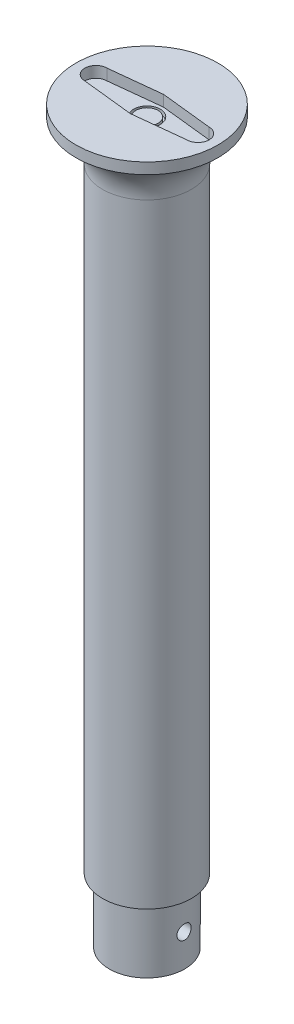
ISO-10303-21;
HEADER;
FILE_DESCRIPTION(('STEP AP214'),'2;1');
FILE_NAME('part.step','',(''),(''),'','','');
FILE_SCHEMA(('AUTOMOTIVE_DESIGN { 1 0 10303 214 1 1 1 1 }'));
ENDSEC;
DATA;
#1=APPLICATION_CONTEXT('core data for automotive mechanical design processes');
#2=APPLICATION_PROTOCOL_DEFINITION('international standard','automotive_design',2000,#1);
#3=PRODUCT_CONTEXT('',#1,'mechanical');
#4=PRODUCT('Part','Part','',(#3));
#5=PRODUCT_RELATED_PRODUCT_CATEGORY('part','',(#4));
#6=PRODUCT_DEFINITION_FORMATION('','',#4);
#7=PRODUCT_DEFINITION_CONTEXT('part definition',#1,'design');
#8=PRODUCT_DEFINITION('design','',#6,#7);
#9=PRODUCT_DEFINITION_SHAPE('','',#8);
#10=(LENGTH_UNIT() NAMED_UNIT(*) SI_UNIT(.MILLI.,.METRE.));
#11=(NAMED_UNIT(*) PLANE_ANGLE_UNIT() SI_UNIT($,.RADIAN.));
#12=(NAMED_UNIT(*) SI_UNIT($,.STERADIAN.) SOLID_ANGLE_UNIT());
#13=UNCERTAINTY_MEASURE_WITH_UNIT(LENGTH_MEASURE(1.E-05),#10,'distance_accuracy_value','');
#14=(GEOMETRIC_REPRESENTATION_CONTEXT(3) GLOBAL_UNCERTAINTY_ASSIGNED_CONTEXT((#13)) GLOBAL_UNIT_ASSIGNED_CONTEXT((#10,
#11,#12)) REPRESENTATION_CONTEXT('',''));
#15=CARTESIAN_POINT('',(0.,0.,0.));
#16=DIRECTION('',(0.,0.,1.));
#17=DIRECTION('',(1.,0.,0.));
#18=AXIS2_PLACEMENT_3D('',#15,#16,#17);
#19=CARTESIAN_POINT('',(0.,150.,0.));
#20=DIRECTION('',(0.,-1.,0.));
#21=DIRECTION('',(0.,0.,-1.));
#22=AXIS2_PLACEMENT_3D('',#19,#20,#21);
#23=CYLINDRICAL_SURFACE('',#22,10.);
#24=CARTESIAN_POINT('',(0.,138.334848610088,0.));
#25=DIRECTION('',(0.,1.,0.));
#26=DIRECTION('',(0.,0.,1.));
#27=AXIS2_PLACEMENT_3D('',#24,#25,#26);
#28=CIRCLE('',#27,10.);
#29=CARTESIAN_POINT('',(0.,138.334848610088,10.));
#30=VERTEX_POINT('',#29);
#31=EDGE_CURVE('E11',#30,#30,#28,.F.);
#32=ORIENTED_EDGE('',*,*,#31,.T.);
#33=EDGE_LOOP('',(#32));
#34=FACE_BOUND('',#33,.T.);
#35=CARTESIAN_POINT('',(0.,0.,0.));
#36=DIRECTION('',(0.,1.,0.));
#37=DIRECTION('',(0.,0.,1.));
#38=AXIS2_PLACEMENT_3D('',#35,#36,#37);
#39=CIRCLE('',#38,10.);
#40=CARTESIAN_POINT('',(0.,0.,10.));
#41=VERTEX_POINT('',#40);
#42=EDGE_CURVE('E422',#41,#41,#39,.T.);
#43=ORIENTED_EDGE('',*,*,#42,.T.);
#44=EDGE_LOOP('',(#43));
#45=FACE_BOUND('',#44,.T.);
#46=ADVANCED_FACE('F35',(#34,#45),#23,.T.);
#47=CARTESIAN_POINT('',(0.,-14.5,0.));
#48=DIRECTION('',(0.,1.,0.));
#49=DIRECTION('',(0.,0.,1.));
#50=AXIS2_PLACEMENT_3D('',#47,#48,#49);
#51=CYLINDRICAL_SURFACE('',#50,4.5);
#52=CARTESIAN_POINT('',(-4.20594816896262,-7.25,1.6));
#53=CARTESIAN_POINT('',(-4.2059466325233,-7.16323426282831,1.60000176653876));
#54=CARTESIAN_POINT('',(-4.20866230317316,-7.07648076753901,1.59291854303746));
#55=CARTESIAN_POINT('',(-4.21916503629978,-6.9055678211521,1.56488549388392));
#56=CARTESIAN_POINT('',(-4.22695238681397,-6.82140851767154,1.54393488065575));
#57=CARTESIAN_POINT('',(-4.24660725999297,-6.65819300086988,1.48901532580341));
#58=CARTESIAN_POINT('',(-4.25846587175187,-6.5791260868079,1.45507479717298));
#59=CARTESIAN_POINT('',(-4.28491342753786,-6.42777985879535,1.37523793238815));
#60=CARTESIAN_POINT('',(-4.29950309484093,-6.35550235054208,1.32933842782722));
#61=CARTESIAN_POINT('',(-4.33049821715604,-6.21656342045125,1.22469397197854));
#62=CARTESIAN_POINT('',(-4.34695329506707,-6.15024826034116,1.16550386227185));
#63=CARTESIAN_POINT('',(-4.37940865052658,-6.02824515816139,1.03690554397058));
#64=CARTESIAN_POINT('',(-4.39540884266521,-5.9725592007729,0.967495431377931));
#65=CARTESIAN_POINT('',(-4.42573409720288,-5.87177419302494,0.817845378245921));
#66=CARTESIAN_POINT('',(-4.43999410197754,-5.82704499957832,0.737341993795031));
#67=CARTESIAN_POINT('',(-4.46464150404038,-5.7519046294465,0.569357946732585));
#68=CARTESIAN_POINT('',(-4.47503009900766,-5.72148902387014,0.481879452160411));
#69=CARTESIAN_POINT('',(-4.49041230463715,-5.67703421399072,0.306064086351644));
#70=CARTESIAN_POINT('',(-4.49560126712181,-5.66240030586794,0.217895003496385));
#71=CARTESIAN_POINT('',(-4.50069695820355,-5.64802577950272,0.0402101033913121));
#72=CARTESIAN_POINT('',(-4.50060523219943,-5.64828080399948,-0.0493053121862002));
#73=CARTESIAN_POINT('',(-4.4952780652434,-5.66331569739006,-0.22290495965723));
#74=CARTESIAN_POINT('',(-4.4902719419118,-5.6774480261225,-0.30705349767567));
#75=CARTESIAN_POINT('',(-4.47597306722529,-5.71875598140395,-0.471695779950199));
#76=CARTESIAN_POINT('',(-4.46668001702659,-5.74593251727642,-0.552189268981258));
#77=CARTESIAN_POINT('',(-4.44457683482582,-5.81289445625312,-0.708565539356495));
#78=CARTESIAN_POINT('',(-4.43171938190803,-5.85285070479291,-0.784368197988855));
#79=CARTESIAN_POINT('',(-4.40380656130014,-5.94409200933397,-0.928372679166686));
#80=CARTESIAN_POINT('',(-4.38875052802483,-5.99538049841174,-0.996572188915132));
#81=CARTESIAN_POINT('',(-4.35706614584535,-6.1110203126819,-1.12726941265176));
#82=CARTESIAN_POINT('',(-4.34039675880494,-6.17592056928342,-1.1892722210196));
#83=CARTESIAN_POINT('',(-4.30802023964381,-6.31531947092054,-1.30168812080593));
#84=CARTESIAN_POINT('',(-4.29231330191229,-6.38982004559848,-1.35209887656043));
#85=CARTESIAN_POINT('',(-4.26339726836409,-6.54807084785238,-1.4407164863627));
#86=CARTESIAN_POINT('',(-4.25023875982108,-6.63196457914471,-1.47868487992807));
#87=CARTESIAN_POINT('',(-4.22849275530212,-6.80554396451463,-1.53977696586342));
#88=CARTESIAN_POINT('',(-4.21990302236055,-6.89522675998343,-1.56290792408896));
#89=CARTESIAN_POINT('',(-4.20878436155374,-7.07299116017478,-1.59259987609534));
#90=CARTESIAN_POINT('',(-4.20597138454346,-7.16092507733671,-1.599938346667));
#91=CARTESIAN_POINT('',(-4.20592526250886,-7.33679387629433,-1.60006084059022));
#92=CARTESIAN_POINT('',(-4.20869091595066,-7.42472875380396,-1.5928479980256));
#93=CARTESIAN_POINT('',(-4.21920440878006,-7.59433850449755,-1.56477477747803));
#94=CARTESIAN_POINT('',(-4.2267435811876,-7.67612226506307,-1.54448538518019));
#95=CARTESIAN_POINT('',(-4.24571569518896,-7.83509788139652,-1.49153731182258));
#96=CARTESIAN_POINT('',(-4.25714938455108,-7.91228885197801,-1.45887625520133));
#97=CARTESIAN_POINT('',(-4.28311428356285,-8.06287572892673,-1.38082408078295));
#98=CARTESIAN_POINT('',(-4.29773959575628,-8.13604546583477,-1.33502880420585));
#99=CARTESIAN_POINT('',(-4.32827026027054,-8.273940409037,-1.23245127572623));
#100=CARTESIAN_POINT('',(-4.34417603760685,-8.33866279262185,-1.17566536692775));
#101=CARTESIAN_POINT('',(-4.37655106164894,-8.46157460727323,-1.04895384178491));
#102=CARTESIAN_POINT('',(-4.39300206653244,-8.51919617929677,-0.978470952986765));
#103=CARTESIAN_POINT('',(-4.42374953260242,-8.62184694046426,-0.828430051411223));
#104=CARTESIAN_POINT('',(-4.43804603306841,-8.66687635919287,-0.748872204128968));
#105=CARTESIAN_POINT('',(-4.46283245956967,-8.74270057384014,-0.583179723822163));
#106=CARTESIAN_POINT('',(-4.47334198935967,-8.77356891041073,-0.497081838670387));
#107=CARTESIAN_POINT('',(-4.48944893555702,-8.82023476087969,-0.320462563958087));
#108=CARTESIAN_POINT('',(-4.49504839987068,-8.83603855818543,-0.229943035237847));
#109=CARTESIAN_POINT('',(-4.50052895830501,-8.8515016350738,-0.0522106120370213));
#110=CARTESIAN_POINT('',(-4.50069711468001,-8.85197138370821,0.034923611012784));
#111=CARTESIAN_POINT('',(-4.49602458744543,-8.83879676601807,0.207972694133839));
#112=CARTESIAN_POINT('',(-4.49118440869754,-8.82515382231354,0.293887676224896));
#113=CARTESIAN_POINT('',(-4.47715852799092,-8.78469752023003,0.460318849771978));
#114=CARTESIAN_POINT('',(-4.4680622130594,-8.75815466054012,0.540908883445951));
#115=CARTESIAN_POINT('',(-4.44646479553112,-8.69291155102766,0.696511100383458));
#116=CARTESIAN_POINT('',(-4.43396305599403,-8.65420902669031,0.771522236842401));
#117=CARTESIAN_POINT('',(-4.40620368815907,-8.56397982266331,0.91710460814753));
#118=CARTESIAN_POINT('',(-4.39085607935692,-8.51200349786353,0.987379726148113));
#119=CARTESIAN_POINT('',(-4.35930983262607,-8.39743699418361,1.11846844464826));
#120=CARTESIAN_POINT('',(-4.34311090638464,-8.33484320332651,1.17927881177039));
#121=CARTESIAN_POINT('',(-4.31078383381187,-8.19737295049359,1.29258553896772));
#122=CARTESIAN_POINT('',(-4.2946934875441,-8.12206282098584,1.34456840125154));
#123=CARTESIAN_POINT('',(-4.26528713327712,-7.96326623970469,1.43513154115348));
#124=CARTESIAN_POINT('',(-4.25197089911296,-7.87978045528407,1.47371291152588));
#125=CARTESIAN_POINT('',(-4.22981442205812,-7.70681156384301,1.53615714900875));
#126=CARTESIAN_POINT('',(-4.22097742332361,-7.61732416302126,1.56000935101059));
#127=CARTESIAN_POINT('',(-4.20904652279639,-7.43521882297485,1.59192596833137));
#128=CARTESIAN_POINT('',(-4.2059498087577,-7.34260243934036,1.59999811462677));
#129=CARTESIAN_POINT('',(-4.20594816896262,-7.25,1.6));
#130=B_SPLINE_CURVE_WITH_KNOTS('',3,(#52,#53,#54,#55,#56,#57,#58,#59,#60,#61,#62,#63,#64,#65,
#66,#67,#68,#69,#70,#71,#72,#73,#74,#75,#76,#77,#78,#79,#80,#81,#82,#83,#84,#85,#86,#87,#88,#89,
#90,#91,#92,#93,#94,#95,#96,#97,#98,#99,#100,#101,#102,#103,#104,#105,#106,#107,#108,#109,#110,
#111,#112,#113,#114,#115,#116,#117,#118,#119,#120,#121,#122,#123,#124,#125,#126,#127,#128,#129),
.UNSPECIFIED.,.T.,.F.,(4,2,2,2,2,2,2,2,2,2,2,2,2,2,2,2,2,2,2,2,2,2,2,2,2,2,2,2,2,2,2,2,2,2,2,2,
2,2,4),(0.,0.259953291970315,0.519921348833398,0.779323994607175,1.03879543642786,
1.30878128533634,1.57881749670462,1.85699611078511,2.13508859452633,2.40229005360034,
2.66941331629628,2.92463711542367,3.17987870901695,3.43868609999424,3.69757200384698,
3.97020163398208,4.24288614778309,4.52052674832307,4.79803128494058,5.06152801645349,
5.32496800170101,5.57761967779331,5.83031989174368,6.09183114994743,6.3534295704366,
6.62965935621094,6.90588410533624,7.18065767081423,7.45531657824236,7.7154337013378,
7.97552460606454,8.23038272661511,8.48528854782629,8.75035401487215,9.01550983658238,
9.29290814086468,9.57028382084662,9.84786010846342,10.1253003715868),.UNSPECIFIED.);
#131=CARTESIAN_POINT('',(-4.20594816896262,-7.25,1.6));
#132=VERTEX_POINT('',#131);
#133=EDGE_CURVE('E152',#132,#132,#130,.T.);
#134=ORIENTED_EDGE('',*,*,#133,.T.);
#135=EDGE_LOOP('',(#134));
#136=FACE_BOUND('',#135,.T.);
#137=CARTESIAN_POINT('',(0.,-14.5,0.));
#138=DIRECTION('',(0.,-1.,0.));
#139=DIRECTION('',(0.,0.,-1.));
#140=AXIS2_PLACEMENT_3D('',#137,#138,#139);
#141=CIRCLE('',#140,4.5);
#142=CARTESIAN_POINT('',(0.,-14.5,-4.5));
#143=VERTEX_POINT('',#142);
#144=EDGE_CURVE('E415',#143,#143,#141,.T.);
#145=ORIENTED_EDGE('',*,*,#144,.T.);
#146=EDGE_LOOP('',(#145));
#147=FACE_BOUND('',#146,.T.);
#148=CARTESIAN_POINT('',(0.,0.,0.));
#149=DIRECTION('',(0.,-1.,0.));
#150=DIRECTION('',(0.,0.,-1.));
#151=AXIS2_PLACEMENT_3D('',#148,#149,#150);
#152=CIRCLE('',#151,4.5);
#153=CARTESIAN_POINT('',(0.,0.,-4.5));
#154=VERTEX_POINT('',#153);
#155=EDGE_CURVE('E413',#154,#154,#152,.T.);
#156=ORIENTED_EDGE('',*,*,#155,.F.);
#157=EDGE_LOOP('',(#156));
#158=FACE_BOUND('',#157,.T.);
#159=CARTESIAN_POINT('',(4.20594816896261,-7.25,1.6));
#160=CARTESIAN_POINT('',(4.2059466325233,-7.33676573717169,1.60000176653876));
#161=CARTESIAN_POINT('',(4.20866230317316,-7.42351923246098,1.59291854303746));
#162=CARTESIAN_POINT('',(4.21916503629978,-7.59443217884789,1.56488549388392));
#163=CARTESIAN_POINT('',(4.22695238681397,-7.67859148232846,1.54393488065575));
#164=CARTESIAN_POINT('',(4.24660725999297,-7.84180699913012,1.48901532580341));
#165=CARTESIAN_POINT('',(4.25846587175187,-7.9208739131921,1.45507479717298));
#166=CARTESIAN_POINT('',(4.28491342753786,-8.07222014120465,1.37523793238815));
#167=CARTESIAN_POINT('',(4.29950309484093,-8.14449764945791,1.32933842782722));
#168=CARTESIAN_POINT('',(4.33049821715604,-8.28343657954875,1.22469397197854));
#169=CARTESIAN_POINT('',(4.34695329506707,-8.34975173965884,1.16550386227185));
#170=CARTESIAN_POINT('',(4.37940865052658,-8.47175484183861,1.03690554397058));
#171=CARTESIAN_POINT('',(4.39540884266521,-8.5274407992271,0.967495431377929));
#172=CARTESIAN_POINT('',(4.42573409720289,-8.62822580697505,0.817845378245918));
#173=CARTESIAN_POINT('',(4.43999410197754,-8.67295500042168,0.737341993795028));
#174=CARTESIAN_POINT('',(4.46464150404038,-8.7480953705535,0.569357946732582));
#175=CARTESIAN_POINT('',(4.47503009900766,-8.77851097612986,0.481879452160407));
#176=CARTESIAN_POINT('',(4.49041230463715,-8.82296578600928,0.306064086351642));
#177=CARTESIAN_POINT('',(4.49560126712181,-8.83759969413205,0.217895003496382));
#178=CARTESIAN_POINT('',(4.50069695820355,-8.85197422049728,0.04021010339131));
#179=CARTESIAN_POINT('',(4.50060523219943,-8.85171919600052,-0.0493053121862019));
#180=CARTESIAN_POINT('',(4.4952780652434,-8.83668430260993,-0.222904959657231));
#181=CARTESIAN_POINT('',(4.4902719419118,-8.82255197387749,-0.307053497675671));
#182=CARTESIAN_POINT('',(4.47597306722529,-8.78124401859604,-0.4716957799502));
#183=CARTESIAN_POINT('',(4.46668001702659,-8.75406748272358,-0.552189268981258));
#184=CARTESIAN_POINT('',(4.44457683482582,-8.68710554374688,-0.708565539356495));
#185=CARTESIAN_POINT('',(4.43171938190803,-8.64714929520709,-0.784368197988854));
#186=CARTESIAN_POINT('',(4.40380656130014,-8.55590799066603,-0.928372679166685));
#187=CARTESIAN_POINT('',(4.38875052802483,-8.50461950158826,-0.996572188915131));
#188=CARTESIAN_POINT('',(4.35706614584535,-8.3889796873181,-1.12726941265176));
#189=CARTESIAN_POINT('',(4.34039675880494,-8.32407943071658,-1.1892722210196));
#190=CARTESIAN_POINT('',(4.30802023964381,-8.18468052907946,-1.30168812080593));
#191=CARTESIAN_POINT('',(4.29231330191229,-8.11017995440152,-1.35209887656043));
#192=CARTESIAN_POINT('',(4.26339726836409,-7.95192915214762,-1.4407164863627));
#193=CARTESIAN_POINT('',(4.25023875982108,-7.86803542085529,-1.47868487992806));
#194=CARTESIAN_POINT('',(4.22849275530212,-7.69445603548537,-1.53977696586342));
#195=CARTESIAN_POINT('',(4.21990302236055,-7.60477324001657,-1.56290792408896));
#196=CARTESIAN_POINT('',(4.20878436155374,-7.42700883982522,-1.59259987609534));
#197=CARTESIAN_POINT('',(4.20597138454346,-7.33907492266329,-1.599938346667));
#198=CARTESIAN_POINT('',(4.20592526250886,-7.16320612370567,-1.60006084059022));
#199=CARTESIAN_POINT('',(4.20869091595066,-7.07527124619604,-1.5928479980256));
#200=CARTESIAN_POINT('',(4.21920440878006,-6.90566149550245,-1.56477477747803));
#201=CARTESIAN_POINT('',(4.2267435811876,-6.82387773493693,-1.54448538518019));
#202=CARTESIAN_POINT('',(4.24571569518896,-6.66490211860347,-1.49153731182258));
#203=CARTESIAN_POINT('',(4.25714938455108,-6.58771114802199,-1.45887625520133));
#204=CARTESIAN_POINT('',(4.28311428356285,-6.43712427107327,-1.38082408078295));
#205=CARTESIAN_POINT('',(4.29773959575628,-6.36395453416522,-1.33502880420585));
#206=CARTESIAN_POINT('',(4.32827026027054,-6.226059590963,-1.23245127572623));
#207=CARTESIAN_POINT('',(4.34417603760685,-6.16133720737815,-1.17566536692775));
#208=CARTESIAN_POINT('',(4.37655106164894,-6.03842539272677,-1.04895384178491));
#209=CARTESIAN_POINT('',(4.39300206653244,-5.98080382070323,-0.978470952986763));
#210=CARTESIAN_POINT('',(4.42374953260242,-5.87815305953574,-0.828430051411221));
#211=CARTESIAN_POINT('',(4.43804603306841,-5.83312364080712,-0.748872204128965));
#212=CARTESIAN_POINT('',(4.46283245956967,-5.75729942615986,-0.583179723822159));
#213=CARTESIAN_POINT('',(4.47334198935967,-5.72643108958927,-0.497081838670383));
#214=CARTESIAN_POINT('',(4.48944893555703,-5.67976523912031,-0.320462563958083));
#215=CARTESIAN_POINT('',(4.49504839987068,-5.66396144181456,-0.229943035237844));
#216=CARTESIAN_POINT('',(4.50052895830501,-5.64849836492619,-0.0522106120370184));
#217=CARTESIAN_POINT('',(4.50069711468001,-5.64802861629178,0.034923611012787));
#218=CARTESIAN_POINT('',(4.49602458744543,-5.66120323398193,0.207972694133841));
#219=CARTESIAN_POINT('',(4.49118440869754,-5.67484617768645,0.293887676224898));
#220=CARTESIAN_POINT('',(4.47715852799092,-5.71530247976997,0.46031884977198));
#221=CARTESIAN_POINT('',(4.4680622130594,-5.74184533945988,0.540908883445953));
#222=CARTESIAN_POINT('',(4.44646479553112,-5.80708844897234,0.69651110038346));
#223=CARTESIAN_POINT('',(4.43396305599403,-5.84579097330968,0.771522236842402));
#224=CARTESIAN_POINT('',(4.40620368815907,-5.93602017733669,0.917104608147531));
#225=CARTESIAN_POINT('',(4.39085607935692,-5.98799650213647,0.987379726148114));
#226=CARTESIAN_POINT('',(4.35930983262607,-6.10256300581639,1.11846844464826));
#227=CARTESIAN_POINT('',(4.34311090638464,-6.16515679667349,1.17927881177039));
#228=CARTESIAN_POINT('',(4.31078383381187,-6.3026270495064,1.29258553896772));
#229=CARTESIAN_POINT('',(4.2946934875441,-6.37793717901415,1.34456840125154));
#230=CARTESIAN_POINT('',(4.26528713327712,-6.53673376029531,1.43513154115348));
#231=CARTESIAN_POINT('',(4.25197089911296,-6.62021954471593,1.47371291152588));
#232=CARTESIAN_POINT('',(4.22981442205812,-6.79318843615699,1.53615714900875));
#233=CARTESIAN_POINT('',(4.22097742332362,-6.88267583697874,1.56000935101059));
#234=CARTESIAN_POINT('',(4.20904652279639,-7.06478117702515,1.59192596833137));
#235=CARTESIAN_POINT('',(4.20594980875769,-7.15739756065964,1.59999811462677));
#236=CARTESIAN_POINT('',(4.20594816896261,-7.25,1.6));
#237=B_SPLINE_CURVE_WITH_KNOTS('',3,(#159,#160,#161,#162,#163,#164,#165,#166,#167,#168,#169,
#170,#171,#172,#173,#174,#175,#176,#177,#178,#179,#180,#181,#182,#183,#184,#185,#186,#187,#188,
#189,#190,#191,#192,#193,#194,#195,#196,#197,#198,#199,#200,#201,#202,#203,#204,#205,#206,#207,
#208,#209,#210,#211,#212,#213,#214,#215,#216,#217,#218,#219,#220,#221,#222,#223,#224,#225,#226,
#227,#228,#229,#230,#231,#232,#233,#234,#235,#236),.UNSPECIFIED.,.T.,.F.,(4,2,2,2,2,2,2,2,2,2,2,
2,2,2,2,2,2,2,2,2,2,2,2,2,2,2,2,2,2,2,2,2,2,2,2,2,2,2,4),(0.,0.259953291970315,
0.519921348833399,0.779323994607178,1.03879543642786,1.30878128533634,1.57881749670462,
1.85699611078511,2.13508859452633,2.40229005360034,2.66941331629628,2.92463711542367,
3.17987870901695,3.43868609999424,3.69757200384698,3.97020163398208,4.24288614778309,
4.52052674832307,4.79803128494058,5.06152801645348,5.32496800170102,5.57761967779331,
5.83031989174368,6.09183114994743,6.3534295704366,6.62965935621094,6.90588410533624,
7.18065767081424,7.45531657824236,7.71543370133781,7.97552460606454,8.23038272661511,
8.48528854782629,8.75035401487216,9.01550983658238,9.29290814086468,9.57028382084662,
9.84786010846342,10.1253003715868),.UNSPECIFIED.);
#238=CARTESIAN_POINT('',(4.20594816896261,-7.25,1.6));
#239=VERTEX_POINT('',#238);
#240=EDGE_CURVE('E159',#239,#239,#237,.T.);
#241=ORIENTED_EDGE('',*,*,#240,.T.);
#242=EDGE_LOOP('',(#241));
#243=FACE_BOUND('',#242,.T.);
#244=ADVANCED_FACE('F164',(#136,#147,#158,#243),#51,.F.);
#245=CARTESIAN_POINT('',(0.,-14.5,0.));
#246=DIRECTION('',(0.,1.,0.));
#247=DIRECTION('',(0.,0.,1.));
#248=AXIS2_PLACEMENT_3D('',#245,#246,#247);
#249=CYLINDRICAL_SURFACE('',#248,8.5);
#250=CARTESIAN_POINT('',(0.,-14.5,0.));
#251=DIRECTION('',(0.,-1.,0.));
#252=DIRECTION('',(0.,0.,-1.));
#253=AXIS2_PLACEMENT_3D('',#250,#251,#252);
#254=CIRCLE('',#253,8.5);
#255=CARTESIAN_POINT('',(0.,-14.5,-8.5));
#256=VERTEX_POINT('',#255);
#257=EDGE_CURVE('E418',#256,#256,#254,.T.);
#258=ORIENTED_EDGE('',*,*,#257,.F.);
#259=EDGE_LOOP('',(#258));
#260=FACE_BOUND('',#259,.T.);
#261=CARTESIAN_POINT('',(0.,0.,0.));
#262=DIRECTION('',(0.,1.,0.));
#263=DIRECTION('',(0.,0.,1.));
#264=AXIS2_PLACEMENT_3D('',#261,#262,#263);
#265=CIRCLE('',#264,8.5);
#266=CARTESIAN_POINT('',(0.,0.,8.5));
#267=VERTEX_POINT('',#266);
#268=EDGE_CURVE('E43',#267,#267,#265,.F.);
#269=ORIENTED_EDGE('',*,*,#268,.T.);
#270=EDGE_LOOP('',(#269));
#271=FACE_BOUND('',#270,.T.);
#272=CARTESIAN_POINT('',(-8.34805366537614,-7.25,1.6));
#273=CARTESIAN_POINT('',(-8.34805539139312,-7.16098570518997,1.59999659237136));
#274=CARTESIAN_POINT('',(-8.34949285007406,-7.07192727484439,1.59254647274993));
#275=CARTESIAN_POINT('',(-8.35508013689202,-6.89632211693413,1.56296320217409));
#276=CARTESIAN_POINT('',(-8.35923225843588,-6.80977757778565,1.54081763594649));
#277=CARTESIAN_POINT('',(-8.36976232957171,-6.64176645063417,1.48254805241548));
#278=CARTESIAN_POINT('',(-8.37613819719879,-6.56029519660048,1.44643710665958));
#279=CARTESIAN_POINT('',(-8.39039489546249,-6.40457225386523,1.36129650874434));
#280=CARTESIAN_POINT('',(-8.39827561057117,-6.33032001161626,1.31226784817517));
#281=CARTESIAN_POINT('',(-8.41476444932436,-6.190206108696,1.20202810484345));
#282=CARTESIAN_POINT('',(-8.42337975336857,-6.12444813825093,1.14068628665674));
#283=CARTESIAN_POINT('',(-8.4403036356045,-6.00409293511267,1.00784403878949));
#284=CARTESIAN_POINT('',(-8.44861219355331,-5.94949643791735,0.936342940177623));
#285=CARTESIAN_POINT('',(-8.46406338192042,-5.85261635641633,0.784530407755924));
#286=CARTESIAN_POINT('',(-8.47119656563613,-5.81043057910636,0.704155514043926));
#287=CARTESIAN_POINT('',(-8.48341290027211,-5.74019963422934,0.537302444088196));
#288=CARTESIAN_POINT('',(-8.48849622105842,-5.71215329492087,0.450824774261486));
#289=CARTESIAN_POINT('',(-8.49598936058719,-5.6713181148175,0.275295514300155));
#290=CARTESIAN_POINT('',(-8.49842978798203,-5.65835446032132,0.186285921125152));
#291=CARTESIAN_POINT('',(-8.50046768283679,-5.64750790597471,0.0073239370720394));
#292=CARTESIAN_POINT('',(-8.50006539420489,-5.64962371228997,-0.0826283722587071));
#293=CARTESIAN_POINT('',(-8.49648709227791,-5.66874203434344,-0.259723379907989));
#294=CARTESIAN_POINT('',(-8.49334615271647,-5.68555631461757,-0.34688721033506));
#295=CARTESIAN_POINT('',(-8.4846828199301,-5.73329652972428,-0.517133741524338));
#296=CARTESIAN_POINT('',(-8.47916033941311,-5.7642229818213,-0.600216292568577));
#297=CARTESIAN_POINT('',(-8.46629586332026,-5.83948872237355,-0.760487336625653));
#298=CARTESIAN_POINT('',(-8.45894371458407,-5.88390317183126,-0.837639684634004));
#299=CARTESIAN_POINT('',(-8.443232823072,-5.98482874859158,-0.983466653213869));
#300=CARTESIAN_POINT('',(-8.43487397719485,-6.0413411153686,-1.05214040398557));
#301=CARTESIAN_POINT('',(-8.41792294108865,-6.16589535756415,-1.18017616369996));
#302=CARTESIAN_POINT('',(-8.40932914107406,-6.23410191626937,-1.2393778645223));
#303=CARTESIAN_POINT('',(-8.39300019745199,-6.37956004531482,-1.34552615784017));
#304=CARTESIAN_POINT('',(-8.38526506660616,-6.45681175005003,-1.39247256821014));
#305=CARTESIAN_POINT('',(-8.3715268744211,-6.61838084500441,-1.47282390487798));
#306=CARTESIAN_POINT('',(-8.36552681767407,-6.70271016951679,-1.50620538107589));
#307=CARTESIAN_POINT('',(-8.35598401529582,-6.875918829908,-1.55828078789123));
#308=CARTESIAN_POINT('',(-8.35244098887193,-6.96479764461809,-1.57697639686132));
#309=CARTESIAN_POINT('',(-8.34826899194166,-7.14313634685864,-1.59891499272747));
#310=CARTESIAN_POINT('',(-8.34759657995444,-7.23256690680058,-1.60238836190044));
#311=CARTESIAN_POINT('',(-8.34912567503967,-7.41073011547684,-1.59440158482373));
#312=CARTESIAN_POINT('',(-8.35132703880459,-7.49946279879042,-1.58294218323161));
#313=CARTESIAN_POINT('',(-8.35831516898331,-7.67295308405571,-1.545612979683));
#314=CARTESIAN_POINT('',(-8.36308023285296,-7.75773765411963,-1.51986408607974));
#315=CARTESIAN_POINT('',(-8.37464014305879,-7.92178910416461,-1.4548151616231));
#316=CARTESIAN_POINT('',(-8.38143514001204,-8.0010555741751,-1.41551412519378));
#317=CARTESIAN_POINT('',(-8.39638814039238,-8.15283528694131,-1.32394678397368));
#318=CARTESIAN_POINT('',(-8.40456107512384,-8.22525927824918,-1.27153502275713));
#319=CARTESIAN_POINT('',(-8.42130712442404,-8.36036788567538,-1.15543002300358));
#320=CARTESIAN_POINT('',(-8.42988027521774,-8.42305161793743,-1.0917357617843));
#321=CARTESIAN_POINT('',(-8.4466004537163,-8.53776178208368,-0.95384455126335));
#322=CARTESIAN_POINT('',(-8.45474018272925,-8.58963322485571,-0.879517643457107));
#323=CARTESIAN_POINT('',(-8.46955334256691,-8.6801522049963,-0.723070473516725));
#324=CARTESIAN_POINT('',(-8.47622683014965,-8.71880025427312,-0.640950513226995));
#325=CARTESIAN_POINT('',(-8.48732421075794,-8.78154370693494,-0.47167536810701));
#326=CARTESIAN_POINT('',(-8.49175982170861,-8.80571504033628,-0.384549129377305));
#327=CARTESIAN_POINT('',(-8.49793167851094,-8.839061147425,-0.207382225845222));
#328=CARTESIAN_POINT('',(-8.49966821072667,-8.84823751203838,-0.117341871256596));
#329=CARTESIAN_POINT('',(-8.50024049408447,-8.85127745263071,0.061611336408405));
#330=CARTESIAN_POINT('',(-8.49912057850766,-8.84537505510412,0.150520156732275));
#331=CARTESIAN_POINT('',(-8.49419798888985,-8.81893781387398,0.326055196411806));
#332=CARTESIAN_POINT('',(-8.49039534100491,-8.79840311283226,0.412681438013583));
#333=CARTESIAN_POINT('',(-8.48053460772706,-8.74338309699734,0.581067360603541));
#334=CARTESIAN_POINT('',(-8.47448058103017,-8.70892287694671,0.662835493807116));
#335=CARTESIAN_POINT('',(-8.46077225021937,-8.62705816230972,0.819463917643092));
#336=CARTESIAN_POINT('',(-8.45311783777304,-8.57965279138082,0.894323740147237));
#337=CARTESIAN_POINT('',(-8.43691387433263,-8.4724388212613,1.03617620036631));
#338=CARTESIAN_POINT('',(-8.4283530081433,-8.41246124235782,1.10303984312601));
#339=CARTESIAN_POINT('',(-8.41137217193159,-8.28215583946841,1.22583453399441));
#340=CARTESIAN_POINT('',(-8.40295223553237,-8.21182558365338,1.2817630062408));
#341=CARTESIAN_POINT('',(-8.38712064238058,-8.06202548334428,1.38159072893547));
#342=CARTESIAN_POINT('',(-8.37971913443067,-7.98247643085605,1.42537278168145));
#343=CARTESIAN_POINT('',(-8.366884638499,-7.81703805994357,1.49888133023776));
#344=CARTESIAN_POINT('',(-8.36144979763858,-7.73115480157629,1.52862106399658));
#345=CARTESIAN_POINT('',(-8.35429445142775,-7.57918446699003,1.5671724971974));
#346=CARTESIAN_POINT('',(-8.35196808950015,-7.51398584243511,1.57946165921837));
#347=CARTESIAN_POINT('',(-8.34884707503259,-7.3825329488062,1.59587656657863));
#348=CARTESIAN_POINT('',(-8.34805238020979,-7.31627870892418,1.60000253726918));
#349=CARTESIAN_POINT('',(-8.34805366537614,-7.25,1.6));
#350=B_SPLINE_CURVE_WITH_KNOTS('',3,(#272,#273,#274,#275,#276,#277,#278,#279,#280,#281,#282,
#283,#284,#285,#286,#287,#288,#289,#290,#291,#292,#293,#294,#295,#296,#297,#298,#299,#300,#301,
#302,#303,#304,#305,#306,#307,#308,#309,#310,#311,#312,#313,#314,#315,#316,#317,#318,#319,#320,
#321,#322,#323,#324,#325,#326,#327,#328,#329,#330,#331,#332,#333,#334,#335,#336,#337,#338,#339,
#340,#341,#342,#343,#344,#345,#346,#347,#348,#349),.UNSPECIFIED.,.T.,.F.,(4,2,2,2,2,2,2,2,2,2,2,
2,2,2,2,2,2,2,2,2,2,2,2,2,2,2,2,2,2,2,2,2,2,2,2,2,2,2,4),(0.,0.266800328829503,
0.533826348201632,0.800603034687951,1.0673592488143,1.3371137826132,1.60688608646526,
1.87873072554756,2.15055283304114,2.41919201121193,2.68780814012356,2.95303382613267,
3.21826923444665,3.48501064893548,3.75177940511555,4.02267088443979,4.29356638924617,
4.56492822695457,4.83625904796217,5.10346888791315,5.37066540333029,5.63563480731666,
5.90062387640078,6.16869446251957,6.43678935986867,6.70849683925368,6.9801937990206,
7.25045294302678,7.5206834114,7.78674539377934,8.05280478214664,8.31838683622141,
8.5839868737537,8.85341644178676,9.12290939973647,9.39491871729081,9.66667109222013,
9.86533209999876,10.0639876235088),.UNSPECIFIED.);
#351=CARTESIAN_POINT('',(-8.34805366537614,-7.25,1.6));
#352=VERTEX_POINT('',#351);
#353=EDGE_CURVE('E149',#352,#352,#350,.T.);
#354=ORIENTED_EDGE('',*,*,#353,.F.);
#355=EDGE_LOOP('',(#354));
#356=FACE_BOUND('',#355,.T.);
#357=CARTESIAN_POINT('',(8.34805366537614,-7.25,1.6));
#358=CARTESIAN_POINT('',(8.34805539139311,-7.33901429481003,1.59999659237136));
#359=CARTESIAN_POINT('',(8.34949285007406,-7.42807272515561,1.59254647274993));
#360=CARTESIAN_POINT('',(8.35508013689203,-7.60367788306587,1.56296320217409));
#361=CARTESIAN_POINT('',(8.35923225843589,-7.69022242221434,1.54081763594649));
#362=CARTESIAN_POINT('',(8.36976232957171,-7.85823354936583,1.48254805241547));
#363=CARTESIAN_POINT('',(8.37613819719879,-7.93970480339952,1.44643710665958));
#364=CARTESIAN_POINT('',(8.39039489546249,-8.09542774613477,1.36129650874434));
#365=CARTESIAN_POINT('',(8.39827561057117,-8.16967998838373,1.31226784817517));
#366=CARTESIAN_POINT('',(8.41476444932436,-8.309793891304,1.20202810484345));
#367=CARTESIAN_POINT('',(8.42337975336857,-8.37555186174907,1.14068628665673));
#368=CARTESIAN_POINT('',(8.4403036356045,-8.49590706488732,1.00784403878949));
#369=CARTESIAN_POINT('',(8.44861219355331,-8.55050356208265,0.936342940177621));
#370=CARTESIAN_POINT('',(8.46406338192043,-8.64738364358367,0.784530407755922));
#371=CARTESIAN_POINT('',(8.47119656563613,-8.68956942089364,0.704155514043923));
#372=CARTESIAN_POINT('',(8.48341290027211,-8.75980036577066,0.537302444088193));
#373=CARTESIAN_POINT('',(8.48849622105842,-8.78784670507913,0.450824774261483));
#374=CARTESIAN_POINT('',(8.49598936058719,-8.82868188518249,0.275295514300151));
#375=CARTESIAN_POINT('',(8.49842978798203,-8.84164553967868,0.186285921125148));
#376=CARTESIAN_POINT('',(8.50046768283679,-8.85249209402529,0.0073239370720365));
#377=CARTESIAN_POINT('',(8.50006539420488,-8.85037628771002,-0.0826283722587099));
#378=CARTESIAN_POINT('',(8.49648709227791,-8.83125796565656,-0.259723379907992));
#379=CARTESIAN_POINT('',(8.49334615271647,-8.81444368538243,-0.346887210335061));
#380=CARTESIAN_POINT('',(8.4846828199301,-8.76670347027572,-0.517133741524339));
#381=CARTESIAN_POINT('',(8.47916033941311,-8.7357770181787,-0.600216292568579));
#382=CARTESIAN_POINT('',(8.46629586332026,-8.66051127762645,-0.760487336625654));
#383=CARTESIAN_POINT('',(8.45894371458407,-8.61609682816874,-0.837639684634005));
#384=CARTESIAN_POINT('',(8.443232823072,-8.51517125140841,-0.98346665321387));
#385=CARTESIAN_POINT('',(8.43487397719485,-8.4586588846314,-1.05214040398557));
#386=CARTESIAN_POINT('',(8.41792294108865,-8.33410464243585,-1.18017616369996));
#387=CARTESIAN_POINT('',(8.40932914107406,-8.26589808373063,-1.2393778645223));
#388=CARTESIAN_POINT('',(8.39300019745199,-8.12043995468517,-1.34552615784017));
#389=CARTESIAN_POINT('',(8.38526506660616,-8.04318824994997,-1.39247256821014));
#390=CARTESIAN_POINT('',(8.3715268744211,-7.88161915499558,-1.47282390487798));
#391=CARTESIAN_POINT('',(8.36552681767407,-7.7972898304832,-1.50620538107589));
#392=CARTESIAN_POINT('',(8.35598401529582,-7.624081170092,-1.55828078789123));
#393=CARTESIAN_POINT('',(8.35244098887193,-7.5352023553819,-1.57697639686132));
#394=CARTESIAN_POINT('',(8.34826899194166,-7.35686365314136,-1.59891499272747));
#395=CARTESIAN_POINT('',(8.34759657995444,-7.26743309319941,-1.60238836190044));
#396=CARTESIAN_POINT('',(8.34912567503967,-7.08926988452316,-1.59440158482373));
#397=CARTESIAN_POINT('',(8.35132703880459,-7.00053720120958,-1.58294218323161));
#398=CARTESIAN_POINT('',(8.35831516898331,-6.82704691594428,-1.545612979683));
#399=CARTESIAN_POINT('',(8.36308023285296,-6.74226234588036,-1.51986408607973));
#400=CARTESIAN_POINT('',(8.37464014305879,-6.57821089583539,-1.4548151616231));
#401=CARTESIAN_POINT('',(8.38143514001204,-6.49894442582489,-1.41551412519378));
#402=CARTESIAN_POINT('',(8.39638814039238,-6.34716471305869,-1.32394678397368));
#403=CARTESIAN_POINT('',(8.40456107512384,-6.27474072175082,-1.27153502275713));
#404=CARTESIAN_POINT('',(8.42130712442404,-6.13963211432462,-1.15543002300358));
#405=CARTESIAN_POINT('',(8.42988027521774,-6.07694838206257,-1.0917357617843));
#406=CARTESIAN_POINT('',(8.4466004537163,-5.96223821791632,-0.95384455126335));
#407=CARTESIAN_POINT('',(8.45474018272925,-5.91036677514429,-0.879517643457107));
#408=CARTESIAN_POINT('',(8.46955334256691,-5.8198477950037,-0.723070473516725));
#409=CARTESIAN_POINT('',(8.47622683014965,-5.78119974572687,-0.640950513226994));
#410=CARTESIAN_POINT('',(8.48732421075794,-5.71845629306506,-0.471675368107009));
#411=CARTESIAN_POINT('',(8.49175982170861,-5.69428495966371,-0.384549129377305));
#412=CARTESIAN_POINT('',(8.49793167851094,-5.66093885257499,-0.207382225845222));
#413=CARTESIAN_POINT('',(8.49966821072667,-5.65176248796162,-0.117341871256595));
#414=CARTESIAN_POINT('',(8.50024049408447,-5.64872254736929,0.0616113364084069));
#415=CARTESIAN_POINT('',(8.49912057850766,-5.65462494489587,0.150520156732277));
#416=CARTESIAN_POINT('',(8.49419798888985,-5.68106218612602,0.326055196411808));
#417=CARTESIAN_POINT('',(8.49039534100491,-5.70159688716774,0.412681438013585));
#418=CARTESIAN_POINT('',(8.48053460772706,-5.75661690300266,0.581067360603543));
#419=CARTESIAN_POINT('',(8.47448058103017,-5.79107712305328,0.662835493807118));
#420=CARTESIAN_POINT('',(8.46077225021937,-5.87294183769028,0.819463917643095));
#421=CARTESIAN_POINT('',(8.45311783777304,-5.92034720861918,0.894323740147238));
#422=CARTESIAN_POINT('',(8.43691387433263,-6.02756117873869,1.03617620036631));
#423=CARTESIAN_POINT('',(8.4283530081433,-6.08753875764218,1.10303984312601));
#424=CARTESIAN_POINT('',(8.41137217193159,-6.21784416053158,1.22583453399441));
#425=CARTESIAN_POINT('',(8.40295223553237,-6.28817441634662,1.2817630062408));
#426=CARTESIAN_POINT('',(8.38712064238058,-6.43797451665572,1.38159072893547));
#427=CARTESIAN_POINT('',(8.37971913443067,-6.51752356914394,1.42537278168145));
#428=CARTESIAN_POINT('',(8.366884638499,-6.68296194005642,1.49888133023776));
#429=CARTESIAN_POINT('',(8.36144979763858,-6.76884519842371,1.52862106399658));
#430=CARTESIAN_POINT('',(8.35429445142775,-6.92081553300997,1.5671724971974));
#431=CARTESIAN_POINT('',(8.35196808950015,-6.98601415756489,1.57946165921837));
#432=CARTESIAN_POINT('',(8.34884707503259,-7.1174670511938,1.59587656657863));
#433=CARTESIAN_POINT('',(8.34805238020978,-7.18372129107581,1.60000253726918));
#434=CARTESIAN_POINT('',(8.34805366537614,-7.25,1.6));
#435=B_SPLINE_CURVE_WITH_KNOTS('',3,(#357,#358,#359,#360,#361,#362,#363,#364,#365,#366,#367,
#368,#369,#370,#371,#372,#373,#374,#375,#376,#377,#378,#379,#380,#381,#382,#383,#384,#385,#386,
#387,#388,#389,#390,#391,#392,#393,#394,#395,#396,#397,#398,#399,#400,#401,#402,#403,#404,#405,
#406,#407,#408,#409,#410,#411,#412,#413,#414,#415,#416,#417,#418,#419,#420,#421,#422,#423,#424,
#425,#426,#427,#428,#429,#430,#431,#432,#433,#434),.UNSPECIFIED.,.T.,.F.,(4,2,2,2,2,2,2,2,2,2,2,
2,2,2,2,2,2,2,2,2,2,2,2,2,2,2,2,2,2,2,2,2,2,2,2,2,2,2,4),(0.,0.266800328829504,
0.533826348201633,0.800603034687954,1.06735924881431,1.33711378261321,1.60688608646526,
1.87873072554757,2.15055283304115,2.41919201121194,2.68780814012356,2.95303382613267,
3.21826923444665,3.48501064893548,3.75177940511555,4.02267088443979,4.29356638924617,
4.56492822695457,4.83625904796217,5.10346888791315,5.37066540333029,5.63563480731666,
5.90062387640078,6.16869446251957,6.43678935986867,6.70849683925368,6.9801937990206,
7.25045294302678,7.5206834114,7.78674539377934,8.05280478214664,8.31838683622141,
8.58398687375371,8.85341644178676,9.12290939973647,9.39491871729081,9.66667109222013,
9.86533209999875,10.0639876235088),.UNSPECIFIED.);
#436=CARTESIAN_POINT('',(8.34805366537614,-7.25,1.6));
#437=VERTEX_POINT('',#436);
#438=EDGE_CURVE('E160',#437,#437,#435,.T.);
#439=ORIENTED_EDGE('',*,*,#438,.F.);
#440=EDGE_LOOP('',(#439));
#441=FACE_BOUND('',#440,.T.);
#442=ADVANCED_FACE('F188',(#260,#271,#356,#441),#249,.T.);
#443=CARTESIAN_POINT('',(0.,0.,0.));
#444=DIRECTION('',(0.,1.,0.));
#445=DIRECTION('',(0.,0.,1.));
#446=AXIS2_PLACEMENT_3D('',#443,#444,#445);
#447=PLANE('',#446);
#448=ORIENTED_EDGE('',*,*,#268,.F.);
#449=EDGE_LOOP('',(#448));
#450=FACE_BOUND('',#449,.T.);
#451=ORIENTED_EDGE('',*,*,#42,.F.);
#452=EDGE_LOOP('',(#451));
#453=FACE_BOUND('',#452,.T.);
#454=ADVANCED_FACE('F191',(#450,#453),#447,.F.);
#455=CARTESIAN_POINT('',(0.,-14.5,0.));
#456=DIRECTION('',(0.,-1.,0.));
#457=DIRECTION('',(0.,0.,-1.));
#458=AXIS2_PLACEMENT_3D('',#455,#456,#457);
#459=PLANE('',#458);
#460=ORIENTED_EDGE('',*,*,#144,.F.);
#461=EDGE_LOOP('',(#460));
#462=FACE_BOUND('',#461,.T.);
#463=ORIENTED_EDGE('',*,*,#257,.T.);
#464=EDGE_LOOP('',(#463));
#465=FACE_BOUND('',#464,.T.);
#466=ADVANCED_FACE('F177',(#462,#465),#459,.T.);
#467=ORIENTED_EDGE('',*,*,#155,.T.);
#468=EDGE_LOOP('',(#467));
#469=FACE_BOUND('',#468,.T.);
#470=ADVANCED_FACE('F200',(#469),#447,.F.);
#471=CARTESIAN_POINT('',(14.5,-7.25,0.));
#472=DIRECTION('',(-1.,0.,0.));
#473=DIRECTION('',(0.,0.,1.));
#474=AXIS2_PLACEMENT_3D('',#471,#472,#473);
#475=CYLINDRICAL_SURFACE('',#474,1.6);
#476=ORIENTED_EDGE('',*,*,#133,.F.);
#477=EDGE_LOOP('',(#476));
#478=FACE_BOUND('',#477,.T.);
#479=ORIENTED_EDGE('',*,*,#353,.T.);
#480=EDGE_LOOP('',(#479));
#481=FACE_BOUND('',#480,.T.);
#482=ADVANCED_FACE('F174',(#478,#481),#475,.F.);
#483=ORIENTED_EDGE('',*,*,#240,.F.);
#484=EDGE_LOOP('',(#483));
#485=FACE_BOUND('',#484,.T.);
#486=ORIENTED_EDGE('',*,*,#438,.T.);
#487=EDGE_LOOP('',(#486));
#488=FACE_BOUND('',#487,.T.);
#489=ADVANCED_FACE('F168',(#485,#488),#475,.F.);
#490=CARTESIAN_POINT('',(0.,147.5,0.));
#491=DIRECTION('',(0.,1.,0.));
#492=DIRECTION('',(0.,0.,1.));
#493=AXIS2_PLACEMENT_3D('',#490,#491,#492);
#494=CYLINDRICAL_SURFACE('',#493,16.);
#495=CARTESIAN_POINT('',(0.,147.5,0.));
#496=DIRECTION('',(0.,1.,0.));
#497=DIRECTION('',(0.,0.,1.));
#498=AXIS2_PLACEMENT_3D('',#495,#496,#497);
#499=CIRCLE('',#498,16.);
#500=CARTESIAN_POINT('',(0.,147.5,16.));
#501=VERTEX_POINT('',#500);
#502=EDGE_CURVE('E146',#501,#501,#499,.T.);
#503=ORIENTED_EDGE('',*,*,#502,.T.);
#504=EDGE_LOOP('',(#503));
#505=FACE_BOUND('',#504,.T.);
#506=CARTESIAN_POINT('',(0.,150.,0.));
#507=DIRECTION('',(0.,1.,0.));
#508=DIRECTION('',(0.,0.,1.));
#509=AXIS2_PLACEMENT_3D('',#506,#507,#508);
#510=CIRCLE('',#509,16.);
#511=CARTESIAN_POINT('',(0.,150.,16.));
#512=VERTEX_POINT('',#511);
#513=EDGE_CURVE('E140',#512,#512,#510,.T.);
#514=ORIENTED_EDGE('',*,*,#513,.F.);
#515=EDGE_LOOP('',(#514));
#516=FACE_BOUND('',#515,.T.);
#517=ADVANCED_FACE('F173',(#505,#516),#494,.T.);
#518=CARTESIAN_POINT('',(0.,150.,0.));
#519=DIRECTION('',(0.,1.,0.));
#520=DIRECTION('',(0.,0.,1.));
#521=AXIS2_PLACEMENT_3D('',#518,#519,#520);
#522=PLANE('',#521);
#523=CARTESIAN_POINT('',(11.5,150.,0.));
#524=DIRECTION('',(0.,1.,0.));
#525=DIRECTION('',(0.,0.,1.));
#526=AXIS2_PLACEMENT_3D('',#523,#524,#525);
#527=CIRCLE('',#526,2.5);
#528=CARTESIAN_POINT('',(11.5,150.,2.5));
#529=VERTEX_POINT('',#528);
#530=CARTESIAN_POINT('',(11.5,150.,-2.5));
#531=VERTEX_POINT('',#530);
#532=EDGE_CURVE('E50',#529,#531,#527,.T.);
#533=ORIENTED_EDGE('',*,*,#532,.F.);
#534=DIRECTION('',(-0.994144463069457,0.,0.108059180768419));
#535=VECTOR('',#534,1.);
#536=CARTESIAN_POINT('',(0.402849135917795,150.,3.70621205044372));
#537=LINE('',#536,#535);
#538=CARTESIAN_POINT('',(0.,150.,3.75));
#539=VERTEX_POINT('',#538);
#540=EDGE_CURVE('E135',#529,#539,#537,.T.);
#541=ORIENTED_EDGE('',*,*,#540,.T.);
#542=DIRECTION('',(-0.994144463069457,0.,-0.108059180768419));
#543=VECTOR('',#542,1.);
#544=CARTESIAN_POINT('',(-0.402849135917795,150.,3.70621205044372));
#545=LINE('',#544,#543);
#546=CARTESIAN_POINT('',(-11.5,150.,2.5));
#547=VERTEX_POINT('',#546);
#548=EDGE_CURVE('E133',#539,#547,#545,.T.);
#549=ORIENTED_EDGE('',*,*,#548,.T.);
#550=CARTESIAN_POINT('',(-11.5,150.,0.));
#551=DIRECTION('',(0.,1.,0.));
#552=DIRECTION('',(0.,0.,1.));
#553=AXIS2_PLACEMENT_3D('',#550,#551,#552);
#554=CIRCLE('',#553,2.5);
#555=CARTESIAN_POINT('',(-11.5,150.,-2.5));
#556=VERTEX_POINT('',#555);
#557=EDGE_CURVE('E110',#547,#556,#554,.F.);
#558=ORIENTED_EDGE('',*,*,#557,.T.);
#559=DIRECTION('',(0.994144463069457,0.,-0.108059180768419));
#560=VECTOR('',#559,1.);
#561=CARTESIAN_POINT('',(-0.402849135917795,150.,-3.70621205044372));
#562=LINE('',#561,#560);
#563=CARTESIAN_POINT('',(0.,150.,-3.75));
#564=VERTEX_POINT('',#563);
#565=EDGE_CURVE('E129',#556,#564,#562,.T.);
#566=ORIENTED_EDGE('',*,*,#565,.T.);
#567=DIRECTION('',(0.994144463069457,0.,0.108059180768419));
#568=VECTOR('',#567,1.);
#569=CARTESIAN_POINT('',(0.402849135917795,150.,-3.70621205044372));
#570=LINE('',#569,#568);
#571=EDGE_CURVE('E125',#564,#531,#570,.T.);
#572=ORIENTED_EDGE('',*,*,#571,.T.);
#573=EDGE_LOOP('',(#533,#541,#549,#558,#566,#572));
#574=FACE_BOUND('',#573,.T.);
#575=ORIENTED_EDGE('',*,*,#513,.T.);
#576=EDGE_LOOP('',(#575));
#577=FACE_BOUND('',#576,.T.);
#578=ADVANCED_FACE('F211',(#574,#577),#522,.T.);
#579=CARTESIAN_POINT('',(0.,138.334848610088,0.));
#580=DIRECTION('',(0.,1.,0.));
#581=DIRECTION('',(0.,0.,1.));
#582=AXIS2_PLACEMENT_3D('',#579,#580,#581);
#583=TOROIDAL_SURFACE('',#582,20.,10.);
#584=ORIENTED_EDGE('',*,*,#31,.F.);
#585=EDGE_LOOP('',(#584));
#586=FACE_BOUND('',#585,.T.);
#587=ORIENTED_EDGE('',*,*,#502,.F.);
#588=EDGE_LOOP('',(#587));
#589=FACE_BOUND('',#588,.T.);
#590=ADVANCED_FACE('F37',(#586,#589),#583,.F.);
#591=CARTESIAN_POINT('',(11.5,147.5,0.));
#592=DIRECTION('',(0.,1.,0.));
#593=DIRECTION('',(0.,0.,1.));
#594=AXIS2_PLACEMENT_3D('',#591,#592,#593);
#595=CYLINDRICAL_SURFACE('',#594,2.5);
#596=ORIENTED_EDGE('',*,*,#532,.T.);
#597=DIRECTION('',(0.,1.,0.));
#598=VECTOR('',#597,1.);
#599=CARTESIAN_POINT('',(11.5,147.5,-2.5));
#600=LINE('',#599,#598);
#601=CARTESIAN_POINT('',(11.5,147.5,-2.5));
#602=VERTEX_POINT('',#601);
#603=EDGE_CURVE('E123',#602,#531,#600,.T.);
#604=ORIENTED_EDGE('',*,*,#603,.F.);
#605=CARTESIAN_POINT('',(11.5,147.5,0.));
#606=DIRECTION('',(0.,1.,0.));
#607=DIRECTION('',(0.,0.,1.));
#608=AXIS2_PLACEMENT_3D('',#605,#606,#607);
#609=CIRCLE('',#608,2.5);
#610=CARTESIAN_POINT('',(11.5,147.5,2.5));
#611=VERTEX_POINT('',#610);
#612=EDGE_CURVE('E138',#611,#602,#609,.T.);
#613=ORIENTED_EDGE('',*,*,#612,.F.);
#614=DIRECTION('',(0.,1.,0.));
#615=VECTOR('',#614,1.);
#616=CARTESIAN_POINT('',(11.5,147.5,2.5));
#617=LINE('',#616,#615);
#618=EDGE_CURVE('E58',#611,#529,#617,.T.);
#619=ORIENTED_EDGE('',*,*,#618,.T.);
#620=EDGE_LOOP('',(#596,#604,#613,#619));
#621=FACE_BOUND('',#620,.T.);
#622=ADVANCED_FACE('F218',(#621),#595,.F.);
#623=CARTESIAN_POINT('',(0.402849135917795,147.5,3.70621205044372));
#624=DIRECTION('',(-0.108059180768419,0.,-0.994144463069457));
#625=DIRECTION('',(-0.994144463069457,0.,0.108059180768419));
#626=AXIS2_PLACEMENT_3D('',#623,#624,#625);
#627=PLANE('',#626);
#628=ORIENTED_EDGE('',*,*,#540,.F.);
#629=ORIENTED_EDGE('',*,*,#618,.F.);
#630=DIRECTION('',(-0.994144463069457,0.,0.108059180768419));
#631=VECTOR('',#630,1.);
#632=CARTESIAN_POINT('',(0.402849135917795,147.5,3.70621205044372));
#633=LINE('',#632,#631);
#634=CARTESIAN_POINT('',(0.,147.5,3.75));
#635=VERTEX_POINT('',#634);
#636=EDGE_CURVE('E103',#611,#635,#633,.T.);
#637=ORIENTED_EDGE('',*,*,#636,.T.);
#638=DIRECTION('',(0.,1.,0.));
#639=VECTOR('',#638,1.);
#640=CARTESIAN_POINT('',(0.,147.5,3.75));
#641=LINE('',#640,#639);
#642=EDGE_CURVE('E100',#635,#539,#641,.T.);
#643=ORIENTED_EDGE('',*,*,#642,.T.);
#644=EDGE_LOOP('',(#628,#629,#637,#643));
#645=FACE_BOUND('',#644,.T.);
#646=ADVANCED_FACE('F322',(#645),#627,.T.);
#647=CARTESIAN_POINT('',(-0.402849135917795,147.5,3.70621205044372));
#648=DIRECTION('',(0.108059180768419,0.,-0.994144463069457));
#649=DIRECTION('',(-0.994144463069457,0.,-0.108059180768419));
#650=AXIS2_PLACEMENT_3D('',#647,#648,#649);
#651=PLANE('',#650);
#652=ORIENTED_EDGE('',*,*,#548,.F.);
#653=ORIENTED_EDGE('',*,*,#642,.F.);
#654=DIRECTION('',(-0.994144463069457,0.,-0.108059180768419));
#655=VECTOR('',#654,1.);
#656=CARTESIAN_POINT('',(-0.402849135917795,147.5,3.70621205044372));
#657=LINE('',#656,#655);
#658=CARTESIAN_POINT('',(-11.5,147.5,2.5));
#659=VERTEX_POINT('',#658);
#660=EDGE_CURVE('E94',#635,#659,#657,.T.);
#661=ORIENTED_EDGE('',*,*,#660,.T.);
#662=DIRECTION('',(0.,1.,0.));
#663=VECTOR('',#662,1.);
#664=CARTESIAN_POINT('',(-11.5,147.5,2.5));
#665=LINE('',#664,#663);
#666=EDGE_CURVE('E98',#659,#547,#665,.T.);
#667=ORIENTED_EDGE('',*,*,#666,.T.);
#668=EDGE_LOOP('',(#652,#653,#661,#667));
#669=FACE_BOUND('',#668,.T.);
#670=ADVANCED_FACE('F97',(#669),#651,.T.);
#671=CARTESIAN_POINT('',(-11.5,147.5,0.));
#672=DIRECTION('',(0.,1.,0.));
#673=DIRECTION('',(0.,0.,1.));
#674=AXIS2_PLACEMENT_3D('',#671,#672,#673);
#675=CYLINDRICAL_SURFACE('',#674,2.5);
#676=ORIENTED_EDGE('',*,*,#557,.F.);
#677=ORIENTED_EDGE('',*,*,#666,.F.);
#678=CARTESIAN_POINT('',(-11.5,147.5,0.));
#679=DIRECTION('',(0.,1.,0.));
#680=DIRECTION('',(0.,0.,1.));
#681=AXIS2_PLACEMENT_3D('',#678,#679,#680);
#682=CIRCLE('',#681,2.5);
#683=CARTESIAN_POINT('',(-11.5,147.5,-2.5));
#684=VERTEX_POINT('',#683);
#685=EDGE_CURVE('E104',#659,#684,#682,.F.);
#686=ORIENTED_EDGE('',*,*,#685,.T.);
#687=DIRECTION('',(0.,1.,0.));
#688=VECTOR('',#687,1.);
#689=CARTESIAN_POINT('',(-11.5,147.5,-2.5));
#690=LINE('',#689,#688);
#691=EDGE_CURVE('E112',#684,#556,#690,.T.);
#692=ORIENTED_EDGE('',*,*,#691,.T.);
#693=EDGE_LOOP('',(#676,#677,#686,#692));
#694=FACE_BOUND('',#693,.T.);
#695=ADVANCED_FACE('F107',(#694),#675,.F.);
#696=CARTESIAN_POINT('',(-0.402849135917795,147.5,-3.70621205044372));
#697=DIRECTION('',(0.108059180768419,0.,0.994144463069457));
#698=DIRECTION('',(0.994144463069457,0.,-0.108059180768419));
#699=AXIS2_PLACEMENT_3D('',#696,#697,#698);
#700=PLANE('',#699);
#701=ORIENTED_EDGE('',*,*,#565,.F.);
#702=ORIENTED_EDGE('',*,*,#691,.F.);
#703=DIRECTION('',(0.994144463069457,0.,-0.108059180768419));
#704=VECTOR('',#703,1.);
#705=CARTESIAN_POINT('',(-0.402849135917795,147.5,-3.70621205044372));
#706=LINE('',#705,#704);
#707=CARTESIAN_POINT('',(0.,147.5,-3.75));
#708=VERTEX_POINT('',#707);
#709=EDGE_CURVE('E117',#684,#708,#706,.T.);
#710=ORIENTED_EDGE('',*,*,#709,.T.);
#711=DIRECTION('',(0.,1.,0.));
#712=VECTOR('',#711,1.);
#713=CARTESIAN_POINT('',(0.,147.5,-3.75));
#714=LINE('',#713,#712);
#715=EDGE_CURVE('E143',#708,#564,#714,.T.);
#716=ORIENTED_EDGE('',*,*,#715,.T.);
#717=EDGE_LOOP('',(#701,#702,#710,#716));
#718=FACE_BOUND('',#717,.T.);
#719=ADVANCED_FACE('F262',(#718),#700,.T.);
#720=CARTESIAN_POINT('',(0.402849135917795,147.5,-3.70621205044372));
#721=DIRECTION('',(-0.108059180768419,0.,0.994144463069457));
#722=DIRECTION('',(0.994144463069457,0.,0.108059180768419));
#723=AXIS2_PLACEMENT_3D('',#720,#721,#722);
#724=PLANE('',#723);
#725=ORIENTED_EDGE('',*,*,#571,.F.);
#726=ORIENTED_EDGE('',*,*,#715,.F.);
#727=DIRECTION('',(0.994144463069457,0.,0.108059180768419));
#728=VECTOR('',#727,1.);
#729=CARTESIAN_POINT('',(0.402849135917795,147.5,-3.70621205044372));
#730=LINE('',#729,#728);
#731=EDGE_CURVE('E84',#708,#602,#730,.T.);
#732=ORIENTED_EDGE('',*,*,#731,.T.);
#733=ORIENTED_EDGE('',*,*,#603,.T.);
#734=EDGE_LOOP('',(#725,#726,#732,#733));
#735=FACE_BOUND('',#734,.T.);
#736=ADVANCED_FACE('F226',(#735),#724,.T.);
#737=CARTESIAN_POINT('',(0.,147.5,0.));
#738=DIRECTION('',(0.,1.,0.));
#739=DIRECTION('',(0.,0.,1.));
#740=AXIS2_PLACEMENT_3D('',#737,#738,#739);
#741=PLANE('',#740);
#742=CARTESIAN_POINT('',(0.,147.5,0.));
#743=DIRECTION('',(0.,1.,0.));
#744=DIRECTION('',(0.,0.,1.));
#745=AXIS2_PLACEMENT_3D('',#742,#743,#744);
#746=CIRCLE('',#745,3.);
#747=CARTESIAN_POINT('',(0.,147.5,3.));
#748=VERTEX_POINT('',#747);
#749=EDGE_CURVE('E229',#748,#748,#746,.T.);
#750=ORIENTED_EDGE('',*,*,#749,.F.);
#751=EDGE_LOOP('',(#750));
#752=FACE_BOUND('',#751,.T.);
#753=ORIENTED_EDGE('',*,*,#612,.T.);
#754=ORIENTED_EDGE('',*,*,#731,.F.);
#755=ORIENTED_EDGE('',*,*,#709,.F.);
#756=ORIENTED_EDGE('',*,*,#685,.F.);
#757=ORIENTED_EDGE('',*,*,#660,.F.);
#758=ORIENTED_EDGE('',*,*,#636,.F.);
#759=EDGE_LOOP('',(#753,#754,#755,#756,#757,#758));
#760=FACE_BOUND('',#759,.T.);
#761=ADVANCED_FACE('F116',(#752,#760),#741,.T.);
#762=CARTESIAN_POINT('',(0.,146.5,0.));
#763=DIRECTION('',(0.,1.,0.));
#764=DIRECTION('',(0.,0.,1.));
#765=AXIS2_PLACEMENT_3D('',#762,#763,#764);
#766=CYLINDRICAL_SURFACE('',#765,3.);
#767=CARTESIAN_POINT('',(0.,146.5,0.));
#768=DIRECTION('',(0.,1.,0.));
#769=DIRECTION('',(0.,0.,1.));
#770=AXIS2_PLACEMENT_3D('',#767,#768,#769);
#771=CIRCLE('',#770,3.);
#772=CARTESIAN_POINT('',(0.,146.5,3.));
#773=VERTEX_POINT('',#772);
#774=EDGE_CURVE('E126',#773,#773,#771,.T.);
#775=ORIENTED_EDGE('',*,*,#774,.F.);
#776=EDGE_LOOP('',(#775));
#777=FACE_BOUND('',#776,.T.);
#778=ORIENTED_EDGE('',*,*,#749,.T.);
#779=EDGE_LOOP('',(#778));
#780=FACE_BOUND('',#779,.T.);
#781=ADVANCED_FACE('F247',(#777,#780),#766,.F.);
#782=CARTESIAN_POINT('',(0.,146.5,0.));
#783=DIRECTION('',(0.,1.,0.));
#784=DIRECTION('',(0.,0.,1.));
#785=AXIS2_PLACEMENT_3D('',#782,#783,#784);
#786=PLANE('',#785);
#787=CARTESIAN_POINT('',(0.,146.5,0.));
#788=DIRECTION('',(0.,1.,0.));
#789=DIRECTION('',(0.,0.,1.));
#790=AXIS2_PLACEMENT_3D('',#787,#788,#789);
#791=CIRCLE('',#790,2.5);
#792=CARTESIAN_POINT('',(0.,146.5,2.5));
#793=VERTEX_POINT('',#792);
#794=EDGE_CURVE('E232',#793,#793,#791,.T.);
#795=ORIENTED_EDGE('',*,*,#794,.F.);
#796=EDGE_LOOP('',(#795));
#797=FACE_BOUND('',#796,.T.);
#798=ORIENTED_EDGE('',*,*,#774,.T.);
#799=EDGE_LOOP('',(#798));
#800=FACE_BOUND('',#799,.T.);
#801=ADVANCED_FACE('F244',(#797,#800),#786,.T.);
#802=CARTESIAN_POINT('',(0.,146.5,0.));
#803=DIRECTION('',(0.,1.,0.));
#804=DIRECTION('',(0.,0.,1.));
#805=AXIS2_PLACEMENT_3D('',#802,#803,#804);
#806=CYLINDRICAL_SURFACE('',#805,2.5);
#807=ORIENTED_EDGE('',*,*,#794,.T.);
#808=EDGE_LOOP('',(#807));
#809=FACE_BOUND('',#808,.T.);
#810=CARTESIAN_POINT('',(0.,147.5,0.));
#811=DIRECTION('',(0.,1.,0.));
#812=DIRECTION('',(0.,0.,1.));
#813=AXIS2_PLACEMENT_3D('',#810,#811,#812);
#814=CIRCLE('',#813,2.5);
#815=CARTESIAN_POINT('',(0.,147.5,2.5));
#816=VERTEX_POINT('',#815);
#817=EDGE_CURVE('E235',#816,#816,#814,.T.);
#818=ORIENTED_EDGE('',*,*,#817,.F.);
#819=EDGE_LOOP('',(#818));
#820=FACE_BOUND('',#819,.T.);
#821=ADVANCED_FACE('F241',(#809,#820),#806,.T.);
#822=ORIENTED_EDGE('',*,*,#817,.T.);
#823=EDGE_LOOP('',(#822));
#824=FACE_BOUND('',#823,.T.);
#825=ADVANCED_FACE('F258',(#824),#741,.T.);
#826=CLOSED_SHELL('',(#46,#244,#442,#454,#466,#470,#482,#489,#517,#578,#590,#622,#646,#670,#695,
#719,#736,#761,#781,#801,#821,#825));
#827=MANIFOLD_SOLID_BREP('B2',#826);
#828=ADVANCED_BREP_SHAPE_REPRESENTATION('',(#18,#827),#14);
#829=SHAPE_DEFINITION_REPRESENTATION(#9,#828);
ENDSEC;
END-ISO-10303-21;
